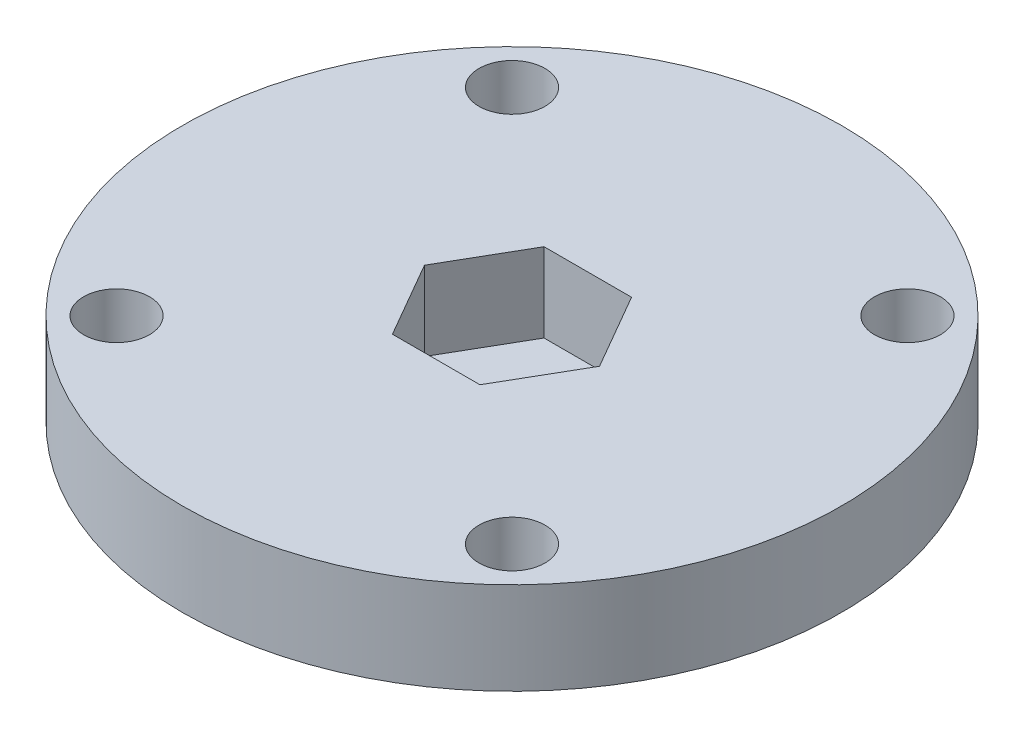
ISO-10303-21;
HEADER;
FILE_DESCRIPTION(('STEP AP214'),'2;1');
FILE_NAME('part.step','',(''),(''),'','','');
FILE_SCHEMA(('AUTOMOTIVE_DESIGN { 1 0 10303 214 1 1 1 1 }'));
ENDSEC;
DATA;
#1=APPLICATION_CONTEXT('core data for automotive mechanical design processes');
#2=APPLICATION_PROTOCOL_DEFINITION('international standard','automotive_design',2000,#1);
#3=PRODUCT_CONTEXT('',#1,'mechanical');
#4=PRODUCT('Part','Part','',(#3));
#5=PRODUCT_RELATED_PRODUCT_CATEGORY('part','',(#4));
#6=PRODUCT_DEFINITION_FORMATION('','',#4);
#7=PRODUCT_DEFINITION_CONTEXT('part definition',#1,'design');
#8=PRODUCT_DEFINITION('design','',#6,#7);
#9=PRODUCT_DEFINITION_SHAPE('','',#8);
#10=(LENGTH_UNIT() NAMED_UNIT(*) SI_UNIT(.MILLI.,.METRE.));
#11=(NAMED_UNIT(*) PLANE_ANGLE_UNIT() SI_UNIT($,.RADIAN.));
#12=(NAMED_UNIT(*) SI_UNIT($,.STERADIAN.) SOLID_ANGLE_UNIT());
#13=UNCERTAINTY_MEASURE_WITH_UNIT(LENGTH_MEASURE(1.E-05),#10,'distance_accuracy_value','');
#14=(GEOMETRIC_REPRESENTATION_CONTEXT(3) GLOBAL_UNCERTAINTY_ASSIGNED_CONTEXT((#13)) GLOBAL_UNIT_ASSIGNED_CONTEXT((#10,
#11,#12)) REPRESENTATION_CONTEXT('',''));
#15=CARTESIAN_POINT('',(0.,0.,0.));
#16=DIRECTION('',(0.,0.,1.));
#17=DIRECTION('',(1.,0.,0.));
#18=AXIS2_PLACEMENT_3D('',#15,#16,#17);
#19=CARTESIAN_POINT('',(0.,5.,0.));
#20=DIRECTION('',(0.,-1.,0.));
#21=DIRECTION('',(0.,0.,-1.));
#22=AXIS2_PLACEMENT_3D('',#19,#20,#21);
#23=CYLINDRICAL_SURFACE('',#22,25.);
#24=CARTESIAN_POINT('',(0.,7.,0.));
#25=DIRECTION('',(0.,1.,0.));
#26=DIRECTION('',(0.,0.,1.));
#27=AXIS2_PLACEMENT_3D('',#24,#25,#26);
#28=CIRCLE('',#27,25.);
#29=CARTESIAN_POINT('',(0.,7.,25.));
#30=VERTEX_POINT('',#29);
#31=EDGE_CURVE('E12',#30,#30,#28,.T.);
#32=ORIENTED_EDGE('',*,*,#31,.F.);
#33=EDGE_LOOP('',(#32));
#34=FACE_BOUND('',#33,.T.);
#35=CARTESIAN_POINT('',(0.,0.,0.));
#36=DIRECTION('',(0.,1.,0.));
#37=DIRECTION('',(0.,0.,1.));
#38=AXIS2_PLACEMENT_3D('',#35,#36,#37);
#39=CIRCLE('',#38,25.);
#40=CARTESIAN_POINT('',(0.,0.,25.));
#41=VERTEX_POINT('',#40);
#42=EDGE_CURVE('E56',#41,#41,#39,.T.);
#43=ORIENTED_EDGE('',*,*,#42,.T.);
#44=EDGE_LOOP('',(#43));
#45=FACE_BOUND('',#44,.T.);
#46=ADVANCED_FACE('F45',(#34,#45),#23,.T.);
#47=CARTESIAN_POINT('',(0.,7.,0.));
#48=DIRECTION('',(0.,1.,0.));
#49=DIRECTION('',(0.,0.,1.));
#50=AXIS2_PLACEMENT_3D('',#47,#48,#49);
#51=PLANE('',#50);
#52=DIRECTION('',(0.5,0.,0.866025403784439));
#53=VECTOR('',#52,1.);
#54=CARTESIAN_POINT('',(-4.97964607176052,7.,2.875));
#55=LINE('',#54,#53);
#56=CARTESIAN_POINT('',(-6.6395280956807,7.,0.));
#57=VERTEX_POINT('',#56);
#58=CARTESIAN_POINT('',(-3.31976404784035,7.,5.75));
#59=VERTEX_POINT('',#58);
#60=EDGE_CURVE('E65',#57,#59,#55,.T.);
#61=ORIENTED_EDGE('',*,*,#60,.F.);
#62=DIRECTION('',(-0.5,0.,0.866025403784439));
#63=VECTOR('',#62,1.);
#64=CARTESIAN_POINT('',(-4.97964607176052,7.,-2.875));
#65=LINE('',#64,#63);
#66=CARTESIAN_POINT('',(-3.31976404784035,7.,-5.75));
#67=VERTEX_POINT('',#66);
#68=EDGE_CURVE('E130',#67,#57,#65,.T.);
#69=ORIENTED_EDGE('',*,*,#68,.F.);
#70=DIRECTION('',(-1.,0.,0.));
#71=VECTOR('',#70,1.);
#72=CARTESIAN_POINT('',(0.,7.,-5.75));
#73=LINE('',#72,#71);
#74=CARTESIAN_POINT('',(3.31976404784035,7.,-5.75));
#75=VERTEX_POINT('',#74);
#76=EDGE_CURVE('E140',#75,#67,#73,.T.);
#77=ORIENTED_EDGE('',*,*,#76,.F.);
#78=DIRECTION('',(-0.5,0.,-0.866025403784439));
#79=VECTOR('',#78,1.);
#80=CARTESIAN_POINT('',(4.97964607176052,7.,-2.875));
#81=LINE('',#80,#79);
#82=CARTESIAN_POINT('',(6.6395280956807,7.,0.));
#83=VERTEX_POINT('',#82);
#84=EDGE_CURVE('E144',#83,#75,#81,.T.);
#85=ORIENTED_EDGE('',*,*,#84,.F.);
#86=DIRECTION('',(0.5,0.,-0.866025403784439));
#87=VECTOR('',#86,1.);
#88=CARTESIAN_POINT('',(4.97964607176052,7.,2.875));
#89=LINE('',#88,#87);
#90=CARTESIAN_POINT('',(3.31976404784035,7.,5.75));
#91=VERTEX_POINT('',#90);
#92=EDGE_CURVE('E107',#91,#83,#89,.T.);
#93=ORIENTED_EDGE('',*,*,#92,.F.);
#94=DIRECTION('',(1.,0.,0.));
#95=VECTOR('',#94,1.);
#96=CARTESIAN_POINT('',(0.,7.,5.75));
#97=LINE('',#96,#95);
#98=EDGE_CURVE('E150',#59,#91,#97,.T.);
#99=ORIENTED_EDGE('',*,*,#98,.F.);
#100=EDGE_LOOP('',(#61,#69,#77,#85,#93,#99));
#101=FACE_BOUND('',#100,.T.);
#102=CARTESIAN_POINT('',(-15.,7.,15.));
#103=DIRECTION('',(0.,1.,0.));
#104=DIRECTION('',(0.,0.,1.));
#105=AXIS2_PLACEMENT_3D('',#102,#103,#104);
#106=CIRCLE('',#105,2.50000000000006);
#107=CARTESIAN_POINT('',(-15.,7.,17.5000000000001));
#108=VERTEX_POINT('',#107);
#109=EDGE_CURVE('E185',#108,#108,#106,.T.);
#110=ORIENTED_EDGE('',*,*,#109,.F.);
#111=EDGE_LOOP('',(#110));
#112=FACE_BOUND('',#111,.T.);
#113=CARTESIAN_POINT('',(15.,7.,15.));
#114=DIRECTION('',(0.,1.,0.));
#115=DIRECTION('',(0.,0.,1.));
#116=AXIS2_PLACEMENT_3D('',#113,#114,#115);
#117=CIRCLE('',#116,2.5);
#118=CARTESIAN_POINT('',(15.,7.,17.5));
#119=VERTEX_POINT('',#118);
#120=EDGE_CURVE('E180',#119,#119,#117,.T.);
#121=ORIENTED_EDGE('',*,*,#120,.F.);
#122=EDGE_LOOP('',(#121));
#123=FACE_BOUND('',#122,.T.);
#124=CARTESIAN_POINT('',(15.,7.,-15.));
#125=DIRECTION('',(0.,1.,0.));
#126=DIRECTION('',(0.,0.,1.));
#127=AXIS2_PLACEMENT_3D('',#124,#125,#126);
#128=CIRCLE('',#127,2.5);
#129=CARTESIAN_POINT('',(15.,7.,-12.5));
#130=VERTEX_POINT('',#129);
#131=EDGE_CURVE('E175',#130,#130,#128,.T.);
#132=ORIENTED_EDGE('',*,*,#131,.F.);
#133=EDGE_LOOP('',(#132));
#134=FACE_BOUND('',#133,.T.);
#135=CARTESIAN_POINT('',(-15.,7.,-15.));
#136=DIRECTION('',(0.,1.,0.));
#137=DIRECTION('',(0.,0.,1.));
#138=AXIS2_PLACEMENT_3D('',#135,#136,#137);
#139=CIRCLE('',#138,2.5);
#140=CARTESIAN_POINT('',(-15.,7.,-12.5));
#141=VERTEX_POINT('',#140);
#142=EDGE_CURVE('E170',#141,#141,#139,.T.);
#143=ORIENTED_EDGE('',*,*,#142,.F.);
#144=EDGE_LOOP('',(#143));
#145=FACE_BOUND('',#144,.T.);
#146=ORIENTED_EDGE('',*,*,#31,.T.);
#147=EDGE_LOOP('',(#146));
#148=FACE_BOUND('',#147,.T.);
#149=ADVANCED_FACE('F216',(#101,#112,#123,#134,#145,#148),#51,.T.);
#150=CARTESIAN_POINT('',(0.,0.,0.));
#151=DIRECTION('',(0.,1.,0.));
#152=DIRECTION('',(0.,0.,1.));
#153=AXIS2_PLACEMENT_3D('',#150,#151,#152);
#154=PLANE('',#153);
#155=CARTESIAN_POINT('',(-15.,0.,15.));
#156=DIRECTION('',(0.,1.,0.));
#157=DIRECTION('',(0.,0.,1.));
#158=AXIS2_PLACEMENT_3D('',#155,#156,#157);
#159=CIRCLE('',#158,2.50000000000006);
#160=CARTESIAN_POINT('',(-15.,0.,17.5000000000001));
#161=VERTEX_POINT('',#160);
#162=EDGE_CURVE('E163',#161,#161,#159,.T.);
#163=ORIENTED_EDGE('',*,*,#162,.T.);
#164=EDGE_LOOP('',(#163));
#165=FACE_BOUND('',#164,.T.);
#166=CARTESIAN_POINT('',(15.,0.,15.));
#167=DIRECTION('',(0.,1.,0.));
#168=DIRECTION('',(0.,0.,1.));
#169=AXIS2_PLACEMENT_3D('',#166,#167,#168);
#170=CIRCLE('',#169,2.5);
#171=CARTESIAN_POINT('',(15.,0.,17.5));
#172=VERTEX_POINT('',#171);
#173=EDGE_CURVE('E184',#172,#172,#170,.T.);
#174=ORIENTED_EDGE('',*,*,#173,.T.);
#175=EDGE_LOOP('',(#174));
#176=FACE_BOUND('',#175,.T.);
#177=CARTESIAN_POINT('',(15.,0.,-15.));
#178=DIRECTION('',(0.,1.,0.));
#179=DIRECTION('',(0.,0.,1.));
#180=AXIS2_PLACEMENT_3D('',#177,#178,#179);
#181=CIRCLE('',#180,2.5);
#182=CARTESIAN_POINT('',(15.,0.,-12.5));
#183=VERTEX_POINT('',#182);
#184=EDGE_CURVE('E179',#183,#183,#181,.T.);
#185=ORIENTED_EDGE('',*,*,#184,.T.);
#186=EDGE_LOOP('',(#185));
#187=FACE_BOUND('',#186,.T.);
#188=CARTESIAN_POINT('',(-15.,0.,-15.));
#189=DIRECTION('',(0.,1.,0.));
#190=DIRECTION('',(0.,0.,1.));
#191=AXIS2_PLACEMENT_3D('',#188,#189,#190);
#192=CIRCLE('',#191,2.5);
#193=CARTESIAN_POINT('',(-15.,0.,-12.5));
#194=VERTEX_POINT('',#193);
#195=EDGE_CURVE('E174',#194,#194,#192,.T.);
#196=ORIENTED_EDGE('',*,*,#195,.T.);
#197=EDGE_LOOP('',(#196));
#198=FACE_BOUND('',#197,.T.);
#199=ORIENTED_EDGE('',*,*,#42,.F.);
#200=EDGE_LOOP('',(#199));
#201=FACE_BOUND('',#200,.T.);
#202=ADVANCED_FACE('F205',(#165,#176,#187,#198,#201),#154,.F.);
#203=CARTESIAN_POINT('',(-15.,0.,-15.));
#204=DIRECTION('',(0.,1.,0.));
#205=DIRECTION('',(0.,0.,1.));
#206=AXIS2_PLACEMENT_3D('',#203,#204,#205);
#207=CYLINDRICAL_SURFACE('',#206,2.5);
#208=ORIENTED_EDGE('',*,*,#195,.F.);
#209=EDGE_LOOP('',(#208));
#210=FACE_BOUND('',#209,.T.);
#211=ORIENTED_EDGE('',*,*,#142,.T.);
#212=EDGE_LOOP('',(#211));
#213=FACE_BOUND('',#212,.T.);
#214=ADVANCED_FACE('F212',(#210,#213),#207,.F.);
#215=CARTESIAN_POINT('',(15.,0.,-15.));
#216=DIRECTION('',(0.,1.,0.));
#217=DIRECTION('',(0.,0.,1.));
#218=AXIS2_PLACEMENT_3D('',#215,#216,#217);
#219=CYLINDRICAL_SURFACE('',#218,2.5);
#220=ORIENTED_EDGE('',*,*,#184,.F.);
#221=EDGE_LOOP('',(#220));
#222=FACE_BOUND('',#221,.T.);
#223=ORIENTED_EDGE('',*,*,#131,.T.);
#224=EDGE_LOOP('',(#223));
#225=FACE_BOUND('',#224,.T.);
#226=ADVANCED_FACE('F208',(#222,#225),#219,.F.);
#227=CARTESIAN_POINT('',(15.,0.,15.));
#228=DIRECTION('',(0.,1.,0.));
#229=DIRECTION('',(0.,0.,1.));
#230=AXIS2_PLACEMENT_3D('',#227,#228,#229);
#231=CYLINDRICAL_SURFACE('',#230,2.5);
#232=ORIENTED_EDGE('',*,*,#173,.F.);
#233=EDGE_LOOP('',(#232));
#234=FACE_BOUND('',#233,.T.);
#235=ORIENTED_EDGE('',*,*,#120,.T.);
#236=EDGE_LOOP('',(#235));
#237=FACE_BOUND('',#236,.T.);
#238=ADVANCED_FACE('F211',(#234,#237),#231,.F.);
#239=CARTESIAN_POINT('',(-15.,0.,15.));
#240=DIRECTION('',(0.,1.,0.));
#241=DIRECTION('',(0.,0.,1.));
#242=AXIS2_PLACEMENT_3D('',#239,#240,#241);
#243=CYLINDRICAL_SURFACE('',#242,2.50000000000006);
#244=ORIENTED_EDGE('',*,*,#162,.F.);
#245=EDGE_LOOP('',(#244));
#246=FACE_BOUND('',#245,.T.);
#247=ORIENTED_EDGE('',*,*,#109,.T.);
#248=EDGE_LOOP('',(#247));
#249=FACE_BOUND('',#248,.T.);
#250=ADVANCED_FACE('F251',(#246,#249),#243,.F.);
#251=CARTESIAN_POINT('',(-6.61066058222122,1.,0.05));
#252=DIRECTION('',(-0.866025403784439,0.,0.5));
#253=DIRECTION('',(0.5,0.,0.866025403784439));
#254=AXIS2_PLACEMENT_3D('',#251,#252,#253);
#255=PLANE('',#254);
#256=ORIENTED_EDGE('',*,*,#60,.T.);
#257=DIRECTION('',(0.,1.,0.));
#258=VECTOR('',#257,1.);
#259=CARTESIAN_POINT('',(-3.31976404784035,1.,5.75));
#260=LINE('',#259,#258);
#261=CARTESIAN_POINT('',(-3.31976404784035,1.,5.75));
#262=VERTEX_POINT('',#261);
#263=EDGE_CURVE('E137',#262,#59,#260,.T.);
#264=ORIENTED_EDGE('',*,*,#263,.F.);
#265=DIRECTION('',(0.5,0.,0.866025403784439));
#266=VECTOR('',#265,1.);
#267=CARTESIAN_POINT('',(-6.61066058222122,1.,0.05));
#268=LINE('',#267,#266);
#269=CARTESIAN_POINT('',(-6.6395280956807,1.,0.));
#270=VERTEX_POINT('',#269);
#271=EDGE_CURVE('E128',#270,#262,#268,.T.);
#272=ORIENTED_EDGE('',*,*,#271,.F.);
#273=DIRECTION('',(0.,1.,0.));
#274=VECTOR('',#273,1.);
#275=CARTESIAN_POINT('',(-6.6395280956807,1.,0.));
#276=LINE('',#275,#274);
#277=EDGE_CURVE('E160',#270,#57,#276,.T.);
#278=ORIENTED_EDGE('',*,*,#277,.T.);
#279=EDGE_LOOP('',(#256,#264,#272,#278));
#280=FACE_BOUND('',#279,.T.);
#281=ADVANCED_FACE('F248',(#280),#255,.F.);
#282=CARTESIAN_POINT('',(-6.61066058222122,1.,-0.05));
#283=DIRECTION('',(-0.866025403784439,0.,-0.5));
#284=DIRECTION('',(-0.5,0.,0.866025403784439));
#285=AXIS2_PLACEMENT_3D('',#282,#283,#284);
#286=PLANE('',#285);
#287=ORIENTED_EDGE('',*,*,#68,.T.);
#288=ORIENTED_EDGE('',*,*,#277,.F.);
#289=DIRECTION('',(-0.5,0.,0.866025403784439));
#290=VECTOR('',#289,1.);
#291=CARTESIAN_POINT('',(-6.61066058222122,1.,-0.05));
#292=LINE('',#291,#290);
#293=CARTESIAN_POINT('',(-3.31976404784035,1.,-5.75));
#294=VERTEX_POINT('',#293);
#295=EDGE_CURVE('E133',#294,#270,#292,.T.);
#296=ORIENTED_EDGE('',*,*,#295,.F.);
#297=DIRECTION('',(0.,1.,0.));
#298=VECTOR('',#297,1.);
#299=CARTESIAN_POINT('',(-3.31976404784035,1.,-5.75));
#300=LINE('',#299,#298);
#301=EDGE_CURVE('E157',#294,#67,#300,.T.);
#302=ORIENTED_EDGE('',*,*,#301,.T.);
#303=EDGE_LOOP('',(#287,#288,#296,#302));
#304=FACE_BOUND('',#303,.T.);
#305=ADVANCED_FACE('F250',(#304),#286,.F.);
#306=CARTESIAN_POINT('',(3.26202902092139,1.,-5.75));
#307=DIRECTION('',(0.,0.,-1.));
#308=DIRECTION('',(-1.,0.,0.));
#309=AXIS2_PLACEMENT_3D('',#306,#307,#308);
#310=PLANE('',#309);
#311=ORIENTED_EDGE('',*,*,#76,.T.);
#312=ORIENTED_EDGE('',*,*,#301,.F.);
#313=DIRECTION('',(-1.,0.,0.));
#314=VECTOR('',#313,1.);
#315=CARTESIAN_POINT('',(3.26202902092139,1.,-5.75));
#316=LINE('',#315,#314);
#317=CARTESIAN_POINT('',(3.31976404784035,1.,-5.75));
#318=VERTEX_POINT('',#317);
#319=EDGE_CURVE('E121',#318,#294,#316,.T.);
#320=ORIENTED_EDGE('',*,*,#319,.F.);
#321=DIRECTION('',(0.,1.,0.));
#322=VECTOR('',#321,1.);
#323=CARTESIAN_POINT('',(3.31976404784035,1.,-5.75));
#324=LINE('',#323,#322);
#325=EDGE_CURVE('E112',#318,#75,#324,.T.);
#326=ORIENTED_EDGE('',*,*,#325,.T.);
#327=EDGE_LOOP('',(#311,#312,#320,#326));
#328=FACE_BOUND('',#327,.T.);
#329=ADVANCED_FACE('F47',(#328),#310,.F.);
#330=CARTESIAN_POINT('',(3.34863156129983,1.,-5.7));
#331=DIRECTION('',(0.866025403784439,0.,-0.5));
#332=DIRECTION('',(-0.5,0.,-0.866025403784439));
#333=AXIS2_PLACEMENT_3D('',#330,#331,#332);
#334=PLANE('',#333);
#335=ORIENTED_EDGE('',*,*,#84,.T.);
#336=ORIENTED_EDGE('',*,*,#325,.F.);
#337=DIRECTION('',(-0.5,0.,-0.866025403784439));
#338=VECTOR('',#337,1.);
#339=CARTESIAN_POINT('',(3.34863156129983,1.,-5.7));
#340=LINE('',#339,#338);
#341=CARTESIAN_POINT('',(6.6395280956807,1.,0.));
#342=VERTEX_POINT('',#341);
#343=EDGE_CURVE('E115',#342,#318,#340,.T.);
#344=ORIENTED_EDGE('',*,*,#343,.F.);
#345=DIRECTION('',(0.,1.,0.));
#346=VECTOR('',#345,1.);
#347=CARTESIAN_POINT('',(6.6395280956807,1.,0.));
#348=LINE('',#347,#346);
#349=EDGE_CURVE('E101',#342,#83,#348,.T.);
#350=ORIENTED_EDGE('',*,*,#349,.T.);
#351=EDGE_LOOP('',(#335,#336,#344,#350));
#352=FACE_BOUND('',#351,.T.);
#353=ADVANCED_FACE('F116',(#352),#334,.F.);
#354=CARTESIAN_POINT('',(3.34863156129983,1.,5.7));
#355=DIRECTION('',(0.866025403784439,0.,0.5));
#356=DIRECTION('',(0.5,0.,-0.866025403784439));
#357=AXIS2_PLACEMENT_3D('',#354,#355,#356);
#358=PLANE('',#357);
#359=ORIENTED_EDGE('',*,*,#92,.T.);
#360=ORIENTED_EDGE('',*,*,#349,.F.);
#361=DIRECTION('',(0.5,0.,-0.866025403784439));
#362=VECTOR('',#361,1.);
#363=CARTESIAN_POINT('',(3.34863156129983,1.,5.7));
#364=LINE('',#363,#362);
#365=CARTESIAN_POINT('',(3.31976404784035,1.,5.75));
#366=VERTEX_POINT('',#365);
#367=EDGE_CURVE('E49',#366,#342,#364,.T.);
#368=ORIENTED_EDGE('',*,*,#367,.F.);
#369=DIRECTION('',(0.,1.,0.));
#370=VECTOR('',#369,1.);
#371=CARTESIAN_POINT('',(3.31976404784035,1.,5.75));
#372=LINE('',#371,#370);
#373=EDGE_CURVE('E95',#366,#91,#372,.T.);
#374=ORIENTED_EDGE('',*,*,#373,.T.);
#375=EDGE_LOOP('',(#359,#360,#368,#374));
#376=FACE_BOUND('',#375,.T.);
#377=ADVANCED_FACE('F103',(#376),#358,.F.);
#378=CARTESIAN_POINT('',(3.26202902092139,1.,5.75));
#379=DIRECTION('',(0.,0.,1.));
#380=DIRECTION('',(1.,0.,0.));
#381=AXIS2_PLACEMENT_3D('',#378,#379,#380);
#382=PLANE('',#381);
#383=ORIENTED_EDGE('',*,*,#98,.T.);
#384=ORIENTED_EDGE('',*,*,#373,.F.);
#385=DIRECTION('',(1.,0.,0.));
#386=VECTOR('',#385,1.);
#387=CARTESIAN_POINT('',(3.26202902092139,1.,5.75));
#388=LINE('',#387,#386);
#389=EDGE_CURVE('E125',#262,#366,#388,.T.);
#390=ORIENTED_EDGE('',*,*,#389,.F.);
#391=ORIENTED_EDGE('',*,*,#263,.T.);
#392=EDGE_LOOP('',(#383,#384,#390,#391));
#393=FACE_BOUND('',#392,.T.);
#394=ADVANCED_FACE('F245',(#393),#382,.F.);
#395=CARTESIAN_POINT('',(0.,1.,0.));
#396=DIRECTION('',(0.,-1.,0.));
#397=DIRECTION('',(0.,0.,-1.));
#398=AXIS2_PLACEMENT_3D('',#395,#396,#397);
#399=PLANE('',#398);
#400=ORIENTED_EDGE('',*,*,#271,.T.);
#401=ORIENTED_EDGE('',*,*,#389,.T.);
#402=ORIENTED_EDGE('',*,*,#367,.T.);
#403=ORIENTED_EDGE('',*,*,#343,.T.);
#404=ORIENTED_EDGE('',*,*,#319,.T.);
#405=ORIENTED_EDGE('',*,*,#295,.T.);
#406=EDGE_LOOP('',(#400,#401,#402,#403,#404,#405));
#407=FACE_BOUND('',#406,.T.);
#408=ADVANCED_FACE('F124',(#407),#399,.F.);
#409=CLOSED_SHELL('',(#46,#149,#202,#214,#226,#238,#250,#281,#305,#329,#353,#377,#394,#408));
#410=MANIFOLD_SOLID_BREP('B2',#409);
#411=ADVANCED_BREP_SHAPE_REPRESENTATION('',(#18,#410),#14);
#412=SHAPE_DEFINITION_REPRESENTATION(#9,#411);
ENDSEC;
END-ISO-10303-21;
